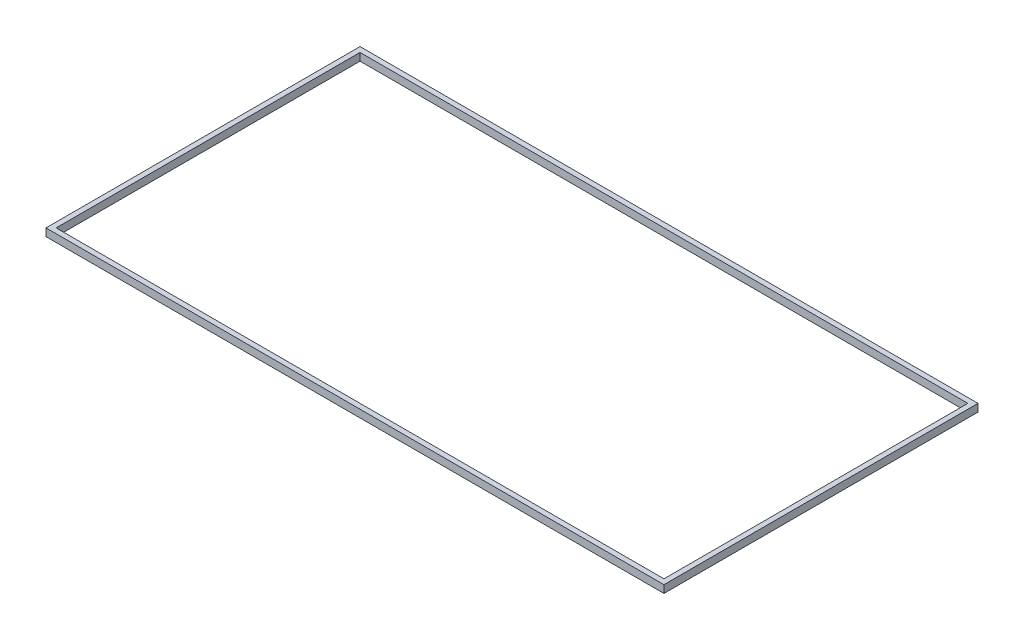
ISO-10303-21;
HEADER;
FILE_DESCRIPTION(('STEP AP214'),'2;1');
FILE_NAME('part.step','',(''),(''),'','','');
FILE_SCHEMA(('AUTOMOTIVE_DESIGN { 1 0 10303 214 1 1 1 1 }'));
ENDSEC;
DATA;
#1=APPLICATION_CONTEXT('core data for automotive mechanical design processes');
#2=APPLICATION_PROTOCOL_DEFINITION('international standard','automotive_design',2000,#1);
#3=PRODUCT_CONTEXT('',#1,'mechanical');
#4=PRODUCT('Part','Part','',(#3));
#5=PRODUCT_RELATED_PRODUCT_CATEGORY('part','',(#4));
#6=PRODUCT_DEFINITION_FORMATION('','',#4);
#7=PRODUCT_DEFINITION_CONTEXT('part definition',#1,'design');
#8=PRODUCT_DEFINITION('design','',#6,#7);
#9=PRODUCT_DEFINITION_SHAPE('','',#8);
#10=(LENGTH_UNIT() NAMED_UNIT(*) SI_UNIT(.MILLI.,.METRE.));
#11=(NAMED_UNIT(*) PLANE_ANGLE_UNIT() SI_UNIT($,.RADIAN.));
#12=(NAMED_UNIT(*) SI_UNIT($,.STERADIAN.) SOLID_ANGLE_UNIT());
#13=UNCERTAINTY_MEASURE_WITH_UNIT(LENGTH_MEASURE(1.E-05),#10,'distance_accuracy_value','');
#14=(GEOMETRIC_REPRESENTATION_CONTEXT(3) GLOBAL_UNCERTAINTY_ASSIGNED_CONTEXT((#13)) GLOBAL_UNIT_ASSIGNED_CONTEXT((#10,
#11,#12)) REPRESENTATION_CONTEXT('',''));
#15=CARTESIAN_POINT('',(0.,0.,0.));
#16=DIRECTION('',(0.,0.,1.));
#17=DIRECTION('',(1.,0.,0.));
#18=AXIS2_PLACEMENT_3D('',#15,#16,#17);
#19=CARTESIAN_POINT('',(0.,15.,0.));
#20=DIRECTION('',(0.,-1.,0.));
#21=DIRECTION('',(0.,0.,-1.));
#22=AXIS2_PLACEMENT_3D('',#19,#20,#21);
#23=PLANE('',#22);
#24=DIRECTION('',(0.,0.,-1.));
#25=VECTOR('',#24,1.);
#26=CARTESIAN_POINT('',(1220.,15.,620.));
#27=LINE('',#26,#25);
#28=CARTESIAN_POINT('',(1220.,15.,620.));
#29=VERTEX_POINT('',#28);
#30=CARTESIAN_POINT('',(1220.,15.,-620.));
#31=VERTEX_POINT('',#30);
#32=EDGE_CURVE('E134',#29,#31,#27,.T.);
#33=ORIENTED_EDGE('',*,*,#32,.T.);
#34=DIRECTION('',(-1.,0.,0.));
#35=VECTOR('',#34,1.);
#36=CARTESIAN_POINT('',(-1220.,15.,-620.));
#37=LINE('',#36,#35);
#38=CARTESIAN_POINT('',(-1220.,15.,-620.));
#39=VERTEX_POINT('',#38);
#40=EDGE_CURVE('E137',#31,#39,#37,.T.);
#41=ORIENTED_EDGE('',*,*,#40,.T.);
#42=DIRECTION('',(0.,0.,1.));
#43=VECTOR('',#42,1.);
#44=CARTESIAN_POINT('',(-1220.,15.,620.));
#45=LINE('',#44,#43);
#46=CARTESIAN_POINT('',(-1220.,15.,620.));
#47=VERTEX_POINT('',#46);
#48=EDGE_CURVE('E140',#39,#47,#45,.T.);
#49=ORIENTED_EDGE('',*,*,#48,.T.);
#50=DIRECTION('',(1.,0.,0.));
#51=VECTOR('',#50,1.);
#52=CARTESIAN_POINT('',(-1220.,15.,620.));
#53=LINE('',#52,#51);
#54=EDGE_CURVE('E142',#47,#29,#53,.T.);
#55=ORIENTED_EDGE('',*,*,#54,.T.);
#56=EDGE_LOOP('',(#33,#41,#49,#55));
#57=FACE_BOUND('',#56,.T.);
#58=DIRECTION('',(0.,0.,-1.));
#59=VECTOR('',#58,1.);
#60=CARTESIAN_POINT('',(1200.,15.,600.));
#61=LINE('',#60,#59);
#62=CARTESIAN_POINT('',(1200.,15.,600.));
#63=VERTEX_POINT('',#62);
#64=CARTESIAN_POINT('',(1200.,15.,-600.));
#65=VERTEX_POINT('',#64);
#66=EDGE_CURVE('E98',#63,#65,#61,.T.);
#67=ORIENTED_EDGE('',*,*,#66,.F.);
#68=DIRECTION('',(1.,0.,0.));
#69=VECTOR('',#68,1.);
#70=CARTESIAN_POINT('',(-1200.,15.,600.));
#71=LINE('',#70,#69);
#72=CARTESIAN_POINT('',(-1200.,15.,600.));
#73=VERTEX_POINT('',#72);
#74=EDGE_CURVE('E120',#73,#63,#71,.T.);
#75=ORIENTED_EDGE('',*,*,#74,.F.);
#76=DIRECTION('',(0.,0.,1.));
#77=VECTOR('',#76,1.);
#78=CARTESIAN_POINT('',(-1200.,15.,600.));
#79=LINE('',#78,#77);
#80=CARTESIAN_POINT('',(-1200.,15.,-600.));
#81=VERTEX_POINT('',#80);
#82=EDGE_CURVE('E118',#81,#73,#79,.T.);
#83=ORIENTED_EDGE('',*,*,#82,.F.);
#84=DIRECTION('',(-1.,0.,0.));
#85=VECTOR('',#84,1.);
#86=CARTESIAN_POINT('',(-1200.,15.,-600.));
#87=LINE('',#86,#85);
#88=EDGE_CURVE('E106',#65,#81,#87,.T.);
#89=ORIENTED_EDGE('',*,*,#88,.F.);
#90=EDGE_LOOP('',(#67,#75,#83,#89));
#91=FACE_BOUND('',#90,.T.);
#92=ADVANCED_FACE('F33',(#57,#91),#23,.F.);
#93=CARTESIAN_POINT('',(0.,-15.,0.));
#94=DIRECTION('',(0.,-1.,0.));
#95=DIRECTION('',(0.,0.,-1.));
#96=AXIS2_PLACEMENT_3D('',#93,#94,#95);
#97=PLANE('',#96);
#98=DIRECTION('',(0.,0.,-1.));
#99=VECTOR('',#98,1.);
#100=CARTESIAN_POINT('',(1220.,-15.,620.));
#101=LINE('',#100,#99);
#102=CARTESIAN_POINT('',(1220.,-15.,620.));
#103=VERTEX_POINT('',#102);
#104=CARTESIAN_POINT('',(1220.,-15.,-620.));
#105=VERTEX_POINT('',#104);
#106=EDGE_CURVE('E114',#103,#105,#101,.T.);
#107=ORIENTED_EDGE('',*,*,#106,.F.);
#108=DIRECTION('',(1.,0.,0.));
#109=VECTOR('',#108,1.);
#110=CARTESIAN_POINT('',(-1220.,-15.,620.));
#111=LINE('',#110,#109);
#112=CARTESIAN_POINT('',(-1220.,-15.,620.));
#113=VERTEX_POINT('',#112);
#114=EDGE_CURVE('E138',#113,#103,#111,.T.);
#115=ORIENTED_EDGE('',*,*,#114,.F.);
#116=DIRECTION('',(0.,0.,1.));
#117=VECTOR('',#116,1.);
#118=CARTESIAN_POINT('',(-1220.,-15.,620.));
#119=LINE('',#118,#117);
#120=CARTESIAN_POINT('',(-1220.,-15.,-620.));
#121=VERTEX_POINT('',#120);
#122=EDGE_CURVE('E149',#121,#113,#119,.T.);
#123=ORIENTED_EDGE('',*,*,#122,.F.);
#124=DIRECTION('',(-1.,0.,0.));
#125=VECTOR('',#124,1.);
#126=CARTESIAN_POINT('',(-1220.,-15.,-620.));
#127=LINE('',#126,#125);
#128=EDGE_CURVE('E147',#105,#121,#127,.T.);
#129=ORIENTED_EDGE('',*,*,#128,.F.);
#130=EDGE_LOOP('',(#107,#115,#123,#129));
#131=FACE_BOUND('',#130,.T.);
#132=DIRECTION('',(1.,0.,0.));
#133=VECTOR('',#132,1.);
#134=CARTESIAN_POINT('',(-1200.,-15.,600.));
#135=LINE('',#134,#133);
#136=CARTESIAN_POINT('',(-1200.,-15.,600.));
#137=VERTEX_POINT('',#136);
#138=CARTESIAN_POINT('',(1200.,-15.,600.));
#139=VERTEX_POINT('',#138);
#140=EDGE_CURVE('E107',#137,#139,#135,.T.);
#141=ORIENTED_EDGE('',*,*,#140,.T.);
#142=DIRECTION('',(0.,0.,-1.));
#143=VECTOR('',#142,1.);
#144=CARTESIAN_POINT('',(1200.,-15.,600.));
#145=LINE('',#144,#143);
#146=CARTESIAN_POINT('',(1200.,-15.,-600.));
#147=VERTEX_POINT('',#146);
#148=EDGE_CURVE('E56',#139,#147,#145,.T.);
#149=ORIENTED_EDGE('',*,*,#148,.T.);
#150=DIRECTION('',(-1.,0.,0.));
#151=VECTOR('',#150,1.);
#152=CARTESIAN_POINT('',(-1200.,-15.,-600.));
#153=LINE('',#152,#151);
#154=CARTESIAN_POINT('',(-1200.,-15.,-600.));
#155=VERTEX_POINT('',#154);
#156=EDGE_CURVE('E113',#147,#155,#153,.T.);
#157=ORIENTED_EDGE('',*,*,#156,.T.);
#158=DIRECTION('',(0.,0.,1.));
#159=VECTOR('',#158,1.);
#160=CARTESIAN_POINT('',(-1200.,-15.,600.));
#161=LINE('',#160,#159);
#162=EDGE_CURVE('E126',#155,#137,#161,.T.);
#163=ORIENTED_EDGE('',*,*,#162,.T.);
#164=EDGE_LOOP('',(#141,#149,#157,#163));
#165=FACE_BOUND('',#164,.T.);
#166=ADVANCED_FACE('F167',(#131,#165),#97,.T.);
#167=CARTESIAN_POINT('',(1220.,15.,620.));
#168=DIRECTION('',(-1.,0.,0.));
#169=DIRECTION('',(0.,0.,1.));
#170=AXIS2_PLACEMENT_3D('',#167,#168,#169);
#171=PLANE('',#170);
#172=ORIENTED_EDGE('',*,*,#106,.T.);
#173=DIRECTION('',(0.,-1.,0.));
#174=VECTOR('',#173,1.);
#175=CARTESIAN_POINT('',(1220.,15.,-620.));
#176=LINE('',#175,#174);
#177=EDGE_CURVE('E11',#31,#105,#176,.T.);
#178=ORIENTED_EDGE('',*,*,#177,.F.);
#179=ORIENTED_EDGE('',*,*,#32,.F.);
#180=DIRECTION('',(0.,-1.,0.));
#181=VECTOR('',#180,1.);
#182=CARTESIAN_POINT('',(1220.,15.,620.));
#183=LINE('',#182,#181);
#184=EDGE_CURVE('E144',#29,#103,#183,.T.);
#185=ORIENTED_EDGE('',*,*,#184,.T.);
#186=EDGE_LOOP('',(#172,#178,#179,#185));
#187=FACE_BOUND('',#186,.T.);
#188=ADVANCED_FACE('F35',(#187),#171,.F.);
#189=CARTESIAN_POINT('',(-1220.,15.,-620.));
#190=DIRECTION('',(0.,0.,1.));
#191=DIRECTION('',(1.,0.,0.));
#192=AXIS2_PLACEMENT_3D('',#189,#190,#191);
#193=PLANE('',#192);
#194=ORIENTED_EDGE('',*,*,#128,.T.);
#195=DIRECTION('',(0.,-1.,0.));
#196=VECTOR('',#195,1.);
#197=CARTESIAN_POINT('',(-1220.,15.,-620.));
#198=LINE('',#197,#196);
#199=EDGE_CURVE('E41',#39,#121,#198,.T.);
#200=ORIENTED_EDGE('',*,*,#199,.F.);
#201=ORIENTED_EDGE('',*,*,#40,.F.);
#202=ORIENTED_EDGE('',*,*,#177,.T.);
#203=EDGE_LOOP('',(#194,#200,#201,#202));
#204=FACE_BOUND('',#203,.T.);
#205=ADVANCED_FACE('F177',(#204),#193,.F.);
#206=CARTESIAN_POINT('',(-1220.,15.,620.));
#207=DIRECTION('',(1.,0.,0.));
#208=DIRECTION('',(0.,0.,-1.));
#209=AXIS2_PLACEMENT_3D('',#206,#207,#208);
#210=PLANE('',#209);
#211=ORIENTED_EDGE('',*,*,#122,.T.);
#212=DIRECTION('',(0.,-1.,0.));
#213=VECTOR('',#212,1.);
#214=CARTESIAN_POINT('',(-1220.,15.,620.));
#215=LINE('',#214,#213);
#216=EDGE_CURVE('E154',#47,#113,#215,.T.);
#217=ORIENTED_EDGE('',*,*,#216,.F.);
#218=ORIENTED_EDGE('',*,*,#48,.F.);
#219=ORIENTED_EDGE('',*,*,#199,.T.);
#220=EDGE_LOOP('',(#211,#217,#218,#219));
#221=FACE_BOUND('',#220,.T.);
#222=ADVANCED_FACE('F161',(#221),#210,.F.);
#223=CARTESIAN_POINT('',(-1220.,15.,620.));
#224=DIRECTION('',(0.,0.,-1.));
#225=DIRECTION('',(-1.,0.,0.));
#226=AXIS2_PLACEMENT_3D('',#223,#224,#225);
#227=PLANE('',#226);
#228=ORIENTED_EDGE('',*,*,#114,.T.);
#229=ORIENTED_EDGE('',*,*,#184,.F.);
#230=ORIENTED_EDGE('',*,*,#54,.F.);
#231=ORIENTED_EDGE('',*,*,#216,.T.);
#232=EDGE_LOOP('',(#228,#229,#230,#231));
#233=FACE_BOUND('',#232,.T.);
#234=ADVANCED_FACE('F171',(#233),#227,.F.);
#235=CARTESIAN_POINT('',(1200.,15.,600.));
#236=DIRECTION('',(-1.,0.,0.));
#237=DIRECTION('',(0.,0.,1.));
#238=AXIS2_PLACEMENT_3D('',#235,#236,#237);
#239=PLANE('',#238);
#240=ORIENTED_EDGE('',*,*,#148,.F.);
#241=DIRECTION('',(0.,-1.,0.));
#242=VECTOR('',#241,1.);
#243=CARTESIAN_POINT('',(1200.,15.,600.));
#244=LINE('',#243,#242);
#245=EDGE_CURVE('E102',#63,#139,#244,.T.);
#246=ORIENTED_EDGE('',*,*,#245,.F.);
#247=ORIENTED_EDGE('',*,*,#66,.T.);
#248=DIRECTION('',(0.,-1.,0.));
#249=VECTOR('',#248,1.);
#250=CARTESIAN_POINT('',(1200.,15.,-600.));
#251=LINE('',#250,#249);
#252=EDGE_CURVE('E101',#65,#147,#251,.T.);
#253=ORIENTED_EDGE('',*,*,#252,.T.);
#254=EDGE_LOOP('',(#240,#246,#247,#253));
#255=FACE_BOUND('',#254,.T.);
#256=ADVANCED_FACE('F100',(#255),#239,.T.);
#257=CARTESIAN_POINT('',(-1200.,15.,-600.));
#258=DIRECTION('',(0.,0.,1.));
#259=DIRECTION('',(1.,0.,0.));
#260=AXIS2_PLACEMENT_3D('',#257,#258,#259);
#261=PLANE('',#260);
#262=ORIENTED_EDGE('',*,*,#156,.F.);
#263=ORIENTED_EDGE('',*,*,#252,.F.);
#264=ORIENTED_EDGE('',*,*,#88,.T.);
#265=DIRECTION('',(0.,-1.,0.));
#266=VECTOR('',#265,1.);
#267=CARTESIAN_POINT('',(-1200.,15.,-600.));
#268=LINE('',#267,#266);
#269=EDGE_CURVE('E115',#81,#155,#268,.T.);
#270=ORIENTED_EDGE('',*,*,#269,.T.);
#271=EDGE_LOOP('',(#262,#263,#264,#270));
#272=FACE_BOUND('',#271,.T.);
#273=ADVANCED_FACE('F110',(#272),#261,.T.);
#274=CARTESIAN_POINT('',(-1200.,15.,600.));
#275=DIRECTION('',(1.,0.,0.));
#276=DIRECTION('',(0.,0.,-1.));
#277=AXIS2_PLACEMENT_3D('',#274,#275,#276);
#278=PLANE('',#277);
#279=ORIENTED_EDGE('',*,*,#162,.F.);
#280=ORIENTED_EDGE('',*,*,#269,.F.);
#281=ORIENTED_EDGE('',*,*,#82,.T.);
#282=DIRECTION('',(0.,-1.,0.));
#283=VECTOR('',#282,1.);
#284=CARTESIAN_POINT('',(-1200.,15.,600.));
#285=LINE('',#284,#283);
#286=EDGE_CURVE('E48',#73,#137,#285,.T.);
#287=ORIENTED_EDGE('',*,*,#286,.T.);
#288=EDGE_LOOP('',(#279,#280,#281,#287));
#289=FACE_BOUND('',#288,.T.);
#290=ADVANCED_FACE('F200',(#289),#278,.T.);
#291=CARTESIAN_POINT('',(-1200.,15.,600.));
#292=DIRECTION('',(0.,0.,-1.));
#293=DIRECTION('',(-1.,0.,0.));
#294=AXIS2_PLACEMENT_3D('',#291,#292,#293);
#295=PLANE('',#294);
#296=ORIENTED_EDGE('',*,*,#140,.F.);
#297=ORIENTED_EDGE('',*,*,#286,.F.);
#298=ORIENTED_EDGE('',*,*,#74,.T.);
#299=ORIENTED_EDGE('',*,*,#245,.T.);
#300=EDGE_LOOP('',(#296,#297,#298,#299));
#301=FACE_BOUND('',#300,.T.);
#302=ADVANCED_FACE('F204',(#301),#295,.T.);
#303=CLOSED_SHELL('',(#92,#166,#188,#205,#222,#234,#256,#273,#290,#302));
#304=MANIFOLD_SOLID_BREP('B2',#303);
#305=ADVANCED_BREP_SHAPE_REPRESENTATION('',(#18,#304),#14);
#306=SHAPE_DEFINITION_REPRESENTATION(#9,#305);
ENDSEC;
END-ISO-10303-21;
